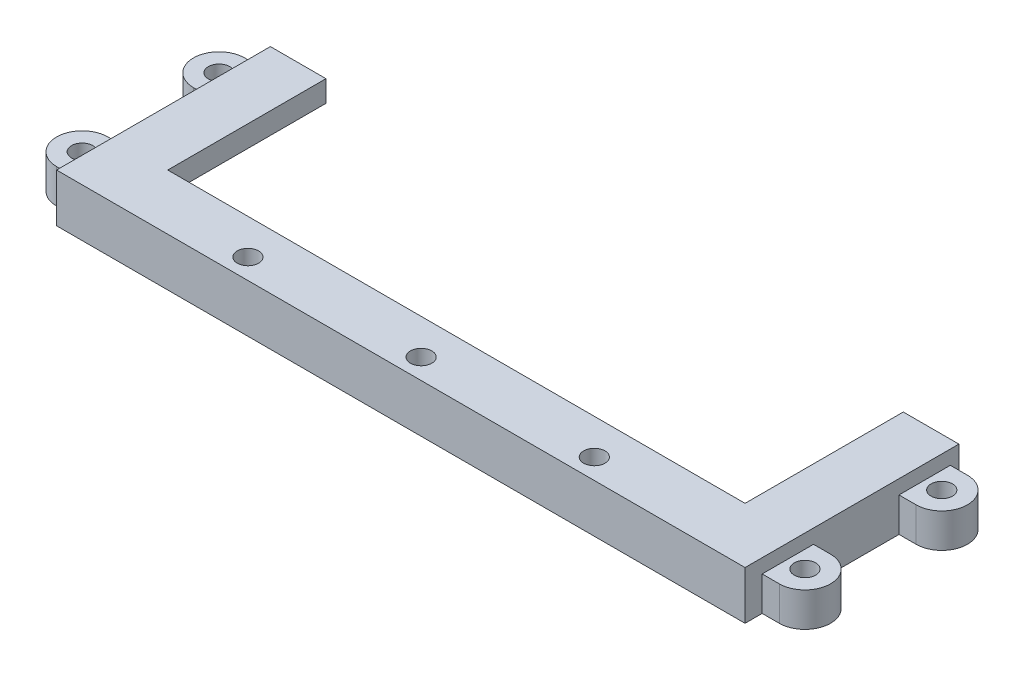
ISO-10303-21;
HEADER;
FILE_DESCRIPTION(('STEP AP214'),'2;1');
FILE_NAME('part.step','',(''),(''),'','','');
FILE_SCHEMA(('AUTOMOTIVE_DESIGN { 1 0 10303 214 1 1 1 1 }'));
ENDSEC;
DATA;
#1=APPLICATION_CONTEXT('core data for automotive mechanical design processes');
#2=APPLICATION_PROTOCOL_DEFINITION('international standard','automotive_design',2000,#1);
#3=PRODUCT_CONTEXT('',#1,'mechanical');
#4=PRODUCT('Part','Part','',(#3));
#5=PRODUCT_RELATED_PRODUCT_CATEGORY('part','',(#4));
#6=PRODUCT_DEFINITION_FORMATION('','',#4);
#7=PRODUCT_DEFINITION_CONTEXT('part definition',#1,'design');
#8=PRODUCT_DEFINITION('design','',#6,#7);
#9=PRODUCT_DEFINITION_SHAPE('','',#8);
#10=(LENGTH_UNIT() NAMED_UNIT(*) SI_UNIT(.MILLI.,.METRE.));
#11=(NAMED_UNIT(*) PLANE_ANGLE_UNIT() SI_UNIT($,.RADIAN.));
#12=(NAMED_UNIT(*) SI_UNIT($,.STERADIAN.) SOLID_ANGLE_UNIT());
#13=UNCERTAINTY_MEASURE_WITH_UNIT(LENGTH_MEASURE(1.E-05),#10,'distance_accuracy_value','');
#14=(GEOMETRIC_REPRESENTATION_CONTEXT(3) GLOBAL_UNCERTAINTY_ASSIGNED_CONTEXT((#13)) GLOBAL_UNIT_ASSIGNED_CONTEXT((#10,
#11,#12)) REPRESENTATION_CONTEXT('',''));
#15=CARTESIAN_POINT('',(0.,0.,0.));
#16=DIRECTION('',(0.,0.,1.));
#17=DIRECTION('',(1.,0.,0.));
#18=AXIS2_PLACEMENT_3D('',#15,#16,#17);
#19=CARTESIAN_POINT('',(40.,0.,45.25));
#20=DIRECTION('',(0.,1.,0.));
#21=DIRECTION('',(0.,0.,1.));
#22=AXIS2_PLACEMENT_3D('',#19,#20,#21);
#23=CYLINDRICAL_SURFACE('',#22,2.5);
#24=CARTESIAN_POINT('',(40.,0.,45.25));
#25=DIRECTION('',(0.,1.,0.));
#26=DIRECTION('',(0.,0.,1.));
#27=AXIS2_PLACEMENT_3D('',#24,#25,#26);
#28=CIRCLE('',#27,2.5);
#29=CARTESIAN_POINT('',(40.,0.,47.75));
#30=VERTEX_POINT('',#29);
#31=EDGE_CURVE('E52',#30,#30,#28,.T.);
#32=ORIENTED_EDGE('',*,*,#31,.F.);
#33=EDGE_LOOP('',(#32));
#34=FACE_BOUND('',#33,.T.);
#35=CARTESIAN_POINT('',(40.,11.3,45.25));
#36=DIRECTION('',(0.,1.,0.));
#37=DIRECTION('',(0.,0.,1.));
#38=AXIS2_PLACEMENT_3D('',#35,#36,#37);
#39=CIRCLE('',#38,2.5);
#40=CARTESIAN_POINT('',(40.,11.3,47.75));
#41=VERTEX_POINT('',#40);
#42=EDGE_CURVE('E11',#41,#41,#39,.T.);
#43=ORIENTED_EDGE('',*,*,#42,.T.);
#44=EDGE_LOOP('',(#43));
#45=FACE_BOUND('',#44,.T.);
#46=ADVANCED_FACE('F44',(#34,#45),#23,.F.);
#47=CARTESIAN_POINT('',(161.,0.,0.));
#48=DIRECTION('',(-1.,0.,0.));
#49=DIRECTION('',(0.,0.,1.));
#50=AXIS2_PLACEMENT_3D('',#47,#48,#49);
#51=PLANE('',#50);
#52=DIRECTION('',(0.,-1.,0.));
#53=VECTOR('',#52,1.);
#54=CARTESIAN_POINT('',(161.,8.,13.999999999999));
#55=LINE('',#54,#53);
#56=CARTESIAN_POINT('',(161.,8.,13.999999999999));
#57=VERTEX_POINT('',#56);
#58=CARTESIAN_POINT('',(161.,0.,13.999999999999));
#59=VERTEX_POINT('',#58);
#60=EDGE_CURVE('E350',#57,#59,#55,.T.);
#61=ORIENTED_EDGE('',*,*,#60,.F.);
#62=DIRECTION('',(0.,0.,1.));
#63=VECTOR('',#62,1.);
#64=CARTESIAN_POINT('',(161.,8.,1.99999999999903));
#65=LINE('',#64,#63);
#66=CARTESIAN_POINT('',(161.,8.,1.99999999999902));
#67=VERTEX_POINT('',#66);
#68=EDGE_CURVE('E323',#67,#57,#65,.T.);
#69=ORIENTED_EDGE('',*,*,#68,.F.);
#70=DIRECTION('',(0.,-1.,0.));
#71=VECTOR('',#70,1.);
#72=CARTESIAN_POINT('',(161.,8.,1.99999999999903));
#73=LINE('',#72,#71);
#74=CARTESIAN_POINT('',(161.,0.,1.99999999999902));
#75=VERTEX_POINT('',#74);
#76=EDGE_CURVE('E339',#67,#75,#73,.T.);
#77=ORIENTED_EDGE('',*,*,#76,.T.);
#78=DIRECTION('',(0.,0.,1.));
#79=VECTOR('',#78,1.);
#80=CARTESIAN_POINT('',(161.,0.,37.));
#81=LINE('',#80,#79);
#82=CARTESIAN_POINT('',(161.,0.,0.));
#83=VERTEX_POINT('',#82);
#84=EDGE_CURVE('E474',#83,#75,#81,.T.);
#85=ORIENTED_EDGE('',*,*,#84,.F.);
#86=DIRECTION('',(0.,-1.,0.));
#87=VECTOR('',#86,1.);
#88=CARTESIAN_POINT('',(161.,0.,0.));
#89=LINE('',#88,#87);
#90=CARTESIAN_POINT('',(161.,11.3,0.));
#91=VERTEX_POINT('',#90);
#92=EDGE_CURVE('E435',#83,#91,#89,.F.);
#93=ORIENTED_EDGE('',*,*,#92,.T.);
#94=DIRECTION('',(0.,0.,-1.));
#95=VECTOR('',#94,1.);
#96=CARTESIAN_POINT('',(161.,11.3,37.));
#97=LINE('',#96,#95);
#98=CARTESIAN_POINT('',(161.,11.3,50.));
#99=VERTEX_POINT('',#98);
#100=EDGE_CURVE('E481',#99,#91,#97,.T.);
#101=ORIENTED_EDGE('',*,*,#100,.F.);
#102=DIRECTION('',(0.,1.,0.));
#103=VECTOR('',#102,1.);
#104=CARTESIAN_POINT('',(161.,11.3,50.));
#105=LINE('',#104,#103);
#106=CARTESIAN_POINT('',(161.,0.,50.));
#107=VERTEX_POINT('',#106);
#108=EDGE_CURVE('E472',#107,#99,#105,.T.);
#109=ORIENTED_EDGE('',*,*,#108,.F.);
#110=CARTESIAN_POINT('',(161.,0.,46.));
#111=VERTEX_POINT('',#110);
#112=EDGE_CURVE('E479',#111,#107,#81,.T.);
#113=ORIENTED_EDGE('',*,*,#112,.F.);
#114=DIRECTION('',(0.,-1.,0.));
#115=VECTOR('',#114,1.);
#116=CARTESIAN_POINT('',(161.,8.,46.));
#117=LINE('',#116,#115);
#118=CARTESIAN_POINT('',(161.,8.,46.));
#119=VERTEX_POINT('',#118);
#120=EDGE_CURVE('E397',#119,#111,#117,.T.);
#121=ORIENTED_EDGE('',*,*,#120,.F.);
#122=DIRECTION('',(0.,0.,-1.));
#123=VECTOR('',#122,1.);
#124=CARTESIAN_POINT('',(161.,8.,46.));
#125=LINE('',#124,#123);
#126=CARTESIAN_POINT('',(161.,8.,34.));
#127=VERTEX_POINT('',#126);
#128=EDGE_CURVE('E368',#119,#127,#125,.T.);
#129=ORIENTED_EDGE('',*,*,#128,.T.);
#130=DIRECTION('',(0.,-1.,0.));
#131=VECTOR('',#130,1.);
#132=CARTESIAN_POINT('',(161.,8.,34.));
#133=LINE('',#132,#131);
#134=CARTESIAN_POINT('',(161.,0.,34.));
#135=VERTEX_POINT('',#134);
#136=EDGE_CURVE('E383',#127,#135,#133,.T.);
#137=ORIENTED_EDGE('',*,*,#136,.T.);
#138=EDGE_CURVE('E478',#59,#135,#81,.T.);
#139=ORIENTED_EDGE('',*,*,#138,.F.);
#140=EDGE_LOOP('',(#61,#69,#77,#85,#93,#101,#109,#113,#121,#129,#137,#139));
#141=FACE_BOUND('',#140,.T.);
#142=ADVANCED_FACE('F567',(#141),#51,.F.);
#143=CARTESIAN_POINT('',(161.,11.3,37.));
#144=DIRECTION('',(0.,0.,-1.));
#145=DIRECTION('',(-1.,0.,0.));
#146=AXIS2_PLACEMENT_3D('',#143,#144,#145);
#147=PLANE('',#146);
#148=DIRECTION('',(1.,0.,0.));
#149=VECTOR('',#148,1.);
#150=CARTESIAN_POINT('',(5.,6.3,37.));
#151=LINE('',#150,#149);
#152=CARTESIAN_POINT('',(13.,6.3,37.));
#153=VERTEX_POINT('',#152);
#154=CARTESIAN_POINT('',(148.,6.3,37.));
#155=VERTEX_POINT('',#154);
#156=EDGE_CURVE('E407',#153,#155,#151,.T.);
#157=ORIENTED_EDGE('',*,*,#156,.F.);
#158=DIRECTION('',(0.,1.,0.));
#159=VECTOR('',#158,1.);
#160=CARTESIAN_POINT('',(13.,11.3,37.));
#161=LINE('',#160,#159);
#162=CARTESIAN_POINT('',(13.,11.3,37.));
#163=VERTEX_POINT('',#162);
#164=EDGE_CURVE('E510',#153,#163,#161,.T.);
#165=ORIENTED_EDGE('',*,*,#164,.T.);
#166=DIRECTION('',(-1.,0.,0.));
#167=VECTOR('',#166,1.);
#168=CARTESIAN_POINT('',(161.,11.3,37.));
#169=LINE('',#168,#167);
#170=CARTESIAN_POINT('',(148.,11.3,37.));
#171=VERTEX_POINT('',#170);
#172=EDGE_CURVE('E486',#171,#163,#169,.T.);
#173=ORIENTED_EDGE('',*,*,#172,.F.);
#174=DIRECTION('',(0.,1.,0.));
#175=VECTOR('',#174,1.);
#176=CARTESIAN_POINT('',(148.,11.3,37.));
#177=LINE('',#176,#175);
#178=EDGE_CURVE('E446',#171,#155,#177,.F.);
#179=ORIENTED_EDGE('',*,*,#178,.T.);
#180=EDGE_LOOP('',(#157,#165,#173,#179));
#181=FACE_BOUND('',#180,.T.);
#182=ADVANCED_FACE('F596',(#181),#147,.T.);
#183=CARTESIAN_POINT('',(0.,0.,0.));
#184=DIRECTION('',(0.,0.,-1.));
#185=DIRECTION('',(-1.,0.,0.));
#186=AXIS2_PLACEMENT_3D('',#183,#184,#185);
#187=PLANE('',#186);
#188=DIRECTION('',(1.,0.,0.));
#189=VECTOR('',#188,1.);
#190=CARTESIAN_POINT('',(5.,0.,0.));
#191=LINE('',#190,#189);
#192=CARTESIAN_POINT('',(0.,0.,0.));
#193=VERTEX_POINT('',#192);
#194=CARTESIAN_POINT('',(5.,0.,0.));
#195=VERTEX_POINT('',#194);
#196=EDGE_CURVE('E534',#193,#195,#191,.T.);
#197=ORIENTED_EDGE('',*,*,#196,.F.);
#198=DIRECTION('',(0.,-1.,0.));
#199=VECTOR('',#198,1.);
#200=CARTESIAN_POINT('',(0.,0.,0.));
#201=LINE('',#200,#199);
#202=CARTESIAN_POINT('',(0.,11.3,0.));
#203=VERTEX_POINT('',#202);
#204=EDGE_CURVE('E527',#203,#193,#201,.T.);
#205=ORIENTED_EDGE('',*,*,#204,.F.);
#206=DIRECTION('',(-1.,0.,0.));
#207=VECTOR('',#206,1.);
#208=CARTESIAN_POINT('',(0.,11.3,0.));
#209=LINE('',#208,#207);
#210=CARTESIAN_POINT('',(13.,11.3,0.));
#211=VERTEX_POINT('',#210);
#212=EDGE_CURVE('E513',#211,#203,#209,.T.);
#213=ORIENTED_EDGE('',*,*,#212,.F.);
#214=DIRECTION('',(0.,1.,0.));
#215=VECTOR('',#214,1.);
#216=CARTESIAN_POINT('',(13.,11.3,0.));
#217=LINE('',#216,#215);
#218=CARTESIAN_POINT('',(13.,6.3,0.));
#219=VERTEX_POINT('',#218);
#220=EDGE_CURVE('E505',#219,#211,#217,.T.);
#221=ORIENTED_EDGE('',*,*,#220,.F.);
#222=DIRECTION('',(1.,0.,0.));
#223=VECTOR('',#222,1.);
#224=CARTESIAN_POINT('',(13.,6.3,0.));
#225=LINE('',#224,#223);
#226=CARTESIAN_POINT('',(5.,6.3,0.));
#227=VERTEX_POINT('',#226);
#228=EDGE_CURVE('E493',#227,#219,#225,.T.);
#229=ORIENTED_EDGE('',*,*,#228,.F.);
#230=DIRECTION('',(0.,1.,0.));
#231=VECTOR('',#230,1.);
#232=CARTESIAN_POINT('',(5.,6.3,0.));
#233=LINE('',#232,#231);
#234=EDGE_CURVE('E512',#195,#227,#233,.T.);
#235=ORIENTED_EDGE('',*,*,#234,.F.);
#236=EDGE_LOOP('',(#197,#205,#213,#221,#229,#235));
#237=FACE_BOUND('',#236,.T.);
#238=ADVANCED_FACE('F599',(#237),#187,.T.);
#239=CARTESIAN_POINT('',(13.,6.3,0.));
#240=DIRECTION('',(0.,-1.,0.));
#241=DIRECTION('',(1.,0.,0.));
#242=AXIS2_PLACEMENT_3D('',#239,#240,#241);
#243=PLANE('',#242);
#244=DIRECTION('',(0.,0.,1.));
#245=VECTOR('',#244,1.);
#246=CARTESIAN_POINT('',(13.,6.3,0.));
#247=LINE('',#246,#245);
#248=EDGE_CURVE('E503',#219,#153,#247,.T.);
#249=ORIENTED_EDGE('',*,*,#248,.T.);
#250=ORIENTED_EDGE('',*,*,#156,.T.);
#251=DIRECTION('',(0.,0.,1.));
#252=VECTOR('',#251,1.);
#253=CARTESIAN_POINT('',(148.,6.3,0.));
#254=LINE('',#253,#252);
#255=CARTESIAN_POINT('',(148.,6.3,0.));
#256=VERTEX_POINT('',#255);
#257=EDGE_CURVE('E459',#256,#155,#254,.T.);
#258=ORIENTED_EDGE('',*,*,#257,.F.);
#259=DIRECTION('',(-1.,0.,0.));
#260=VECTOR('',#259,1.);
#261=CARTESIAN_POINT('',(148.,6.3,0.));
#262=LINE('',#261,#260);
#263=CARTESIAN_POINT('',(156.,6.3,0.));
#264=VERTEX_POINT('',#263);
#265=EDGE_CURVE('E455',#256,#264,#262,.F.);
#266=ORIENTED_EDGE('',*,*,#265,.T.);
#267=DIRECTION('',(0.,0.,1.));
#268=VECTOR('',#267,1.);
#269=CARTESIAN_POINT('',(156.,6.3,0.));
#270=LINE('',#269,#268);
#271=CARTESIAN_POINT('',(156.,6.3,40.5));
#272=VERTEX_POINT('',#271);
#273=EDGE_CURVE('E461',#264,#272,#270,.T.);
#274=ORIENTED_EDGE('',*,*,#273,.T.);
#275=DIRECTION('',(-1.,0.,0.));
#276=VECTOR('',#275,1.);
#277=CARTESIAN_POINT('',(5.,6.3,40.5));
#278=LINE('',#277,#276);
#279=CARTESIAN_POINT('',(5.,6.3,40.5));
#280=VERTEX_POINT('',#279);
#281=EDGE_CURVE('E412',#272,#280,#278,.T.);
#282=ORIENTED_EDGE('',*,*,#281,.T.);
#283=DIRECTION('',(0.,0.,1.));
#284=VECTOR('',#283,1.);
#285=CARTESIAN_POINT('',(5.,6.3,0.));
#286=LINE('',#285,#284);
#287=EDGE_CURVE('E507',#227,#280,#286,.T.);
#288=ORIENTED_EDGE('',*,*,#287,.F.);
#289=ORIENTED_EDGE('',*,*,#228,.T.);
#290=EDGE_LOOP('',(#249,#250,#258,#266,#274,#282,#288,#289));
#291=FACE_BOUND('',#290,.T.);
#292=ADVANCED_FACE('F582',(#291),#243,.T.);
#293=CARTESIAN_POINT('',(13.,11.3,0.));
#294=DIRECTION('',(1.,0.,0.));
#295=DIRECTION('',(0.,0.,-1.));
#296=AXIS2_PLACEMENT_3D('',#293,#294,#295);
#297=PLANE('',#296);
#298=DIRECTION('',(0.,0.,1.));
#299=VECTOR('',#298,1.);
#300=CARTESIAN_POINT('',(13.,11.3,0.));
#301=LINE('',#300,#299);
#302=EDGE_CURVE('E518',#211,#163,#301,.T.);
#303=ORIENTED_EDGE('',*,*,#302,.T.);
#304=ORIENTED_EDGE('',*,*,#164,.F.);
#305=ORIENTED_EDGE('',*,*,#248,.F.);
#306=ORIENTED_EDGE('',*,*,#220,.T.);
#307=EDGE_LOOP('',(#303,#304,#305,#306));
#308=FACE_BOUND('',#307,.T.);
#309=ADVANCED_FACE('F574',(#308),#297,.T.);
#310=CARTESIAN_POINT('',(0.,11.3,0.));
#311=DIRECTION('',(0.,1.,0.));
#312=DIRECTION('',(0.,0.,1.));
#313=AXIS2_PLACEMENT_3D('',#310,#311,#312);
#314=PLANE('',#313);
#315=CARTESIAN_POINT('',(80.5,11.3,45.25));
#316=DIRECTION('',(0.,1.,0.));
#317=DIRECTION('',(0.,0.,1.));
#318=AXIS2_PLACEMENT_3D('',#315,#316,#317);
#319=CIRCLE('',#318,2.5);
#320=CARTESIAN_POINT('',(80.5,11.3,47.75));
#321=VERTEX_POINT('',#320);
#322=EDGE_CURVE('E767',#321,#321,#319,.T.);
#323=ORIENTED_EDGE('',*,*,#322,.F.);
#324=EDGE_LOOP('',(#323));
#325=FACE_BOUND('',#324,.T.);
#326=CARTESIAN_POINT('',(121.,11.3,45.25));
#327=DIRECTION('',(0.,1.,0.));
#328=DIRECTION('',(0.,0.,1.));
#329=AXIS2_PLACEMENT_3D('',#326,#327,#328);
#330=CIRCLE('',#329,2.5);
#331=CARTESIAN_POINT('',(121.,11.3,47.75));
#332=VERTEX_POINT('',#331);
#333=EDGE_CURVE('E769',#332,#332,#330,.T.);
#334=ORIENTED_EDGE('',*,*,#333,.F.);
#335=EDGE_LOOP('',(#334));
#336=FACE_BOUND('',#335,.T.);
#337=DIRECTION('',(0.,0.,1.));
#338=VECTOR('',#337,1.);
#339=CARTESIAN_POINT('',(0.,11.3,0.));
#340=LINE('',#339,#338);
#341=CARTESIAN_POINT('',(0.,11.3,50.));
#342=VERTEX_POINT('',#341);
#343=EDGE_CURVE('E522',#203,#342,#340,.T.);
#344=ORIENTED_EDGE('',*,*,#343,.T.);
#345=DIRECTION('',(-1.,0.,0.));
#346=VECTOR('',#345,1.);
#347=CARTESIAN_POINT('',(161.,11.3,50.));
#348=LINE('',#347,#346);
#349=EDGE_CURVE('E495',#99,#342,#348,.T.);
#350=ORIENTED_EDGE('',*,*,#349,.F.);
#351=ORIENTED_EDGE('',*,*,#100,.T.);
#352=DIRECTION('',(1.,0.,0.));
#353=VECTOR('',#352,1.);
#354=CARTESIAN_POINT('',(161.,11.3,0.));
#355=LINE('',#354,#353);
#356=CARTESIAN_POINT('',(148.,11.3,0.));
#357=VERTEX_POINT('',#356);
#358=EDGE_CURVE('E441',#91,#357,#355,.F.);
#359=ORIENTED_EDGE('',*,*,#358,.T.);
#360=DIRECTION('',(0.,0.,1.));
#361=VECTOR('',#360,1.);
#362=CARTESIAN_POINT('',(148.,11.3,0.));
#363=LINE('',#362,#361);
#364=EDGE_CURVE('E436',#357,#171,#363,.T.);
#365=ORIENTED_EDGE('',*,*,#364,.T.);
#366=ORIENTED_EDGE('',*,*,#172,.T.);
#367=ORIENTED_EDGE('',*,*,#302,.F.);
#368=ORIENTED_EDGE('',*,*,#212,.T.);
#369=EDGE_LOOP('',(#344,#350,#351,#359,#365,#366,#367,#368));
#370=FACE_BOUND('',#369,.T.);
#371=ORIENTED_EDGE('',*,*,#42,.F.);
#372=EDGE_LOOP('',(#371));
#373=FACE_BOUND('',#372,.T.);
#374=ADVANCED_FACE('F575',(#325,#336,#370,#373),#314,.T.);
#375=CARTESIAN_POINT('',(0.,0.,0.));
#376=DIRECTION('',(-1.,0.,0.));
#377=DIRECTION('',(0.,0.,1.));
#378=AXIS2_PLACEMENT_3D('',#375,#376,#377);
#379=PLANE('',#378);
#380=DIRECTION('',(0.,-1.,0.));
#381=VECTOR('',#380,1.);
#382=CARTESIAN_POINT('',(0.,8.,1.99999999999905));
#383=LINE('',#382,#381);
#384=CARTESIAN_POINT('',(0.,8.,1.99999999999905));
#385=VERTEX_POINT('',#384);
#386=CARTESIAN_POINT('',(0.,0.,1.99999999999905));
#387=VERTEX_POINT('',#386);
#388=EDGE_CURVE('E275',#385,#387,#383,.T.);
#389=ORIENTED_EDGE('',*,*,#388,.F.);
#390=DIRECTION('',(0.,0.,1.));
#391=VECTOR('',#390,1.);
#392=CARTESIAN_POINT('',(0.,8.,1.99999999999905));
#393=LINE('',#392,#391);
#394=CARTESIAN_POINT('',(0.,8.,13.9999999999991));
#395=VERTEX_POINT('',#394);
#396=EDGE_CURVE('E251',#385,#395,#393,.T.);
#397=ORIENTED_EDGE('',*,*,#396,.T.);
#398=DIRECTION('',(0.,-1.,0.));
#399=VECTOR('',#398,1.);
#400=CARTESIAN_POINT('',(0.,8.,13.9999999999991));
#401=LINE('',#400,#399);
#402=CARTESIAN_POINT('',(0.,0.,13.9999999999991));
#403=VERTEX_POINT('',#402);
#404=EDGE_CURVE('E243',#395,#403,#401,.T.);
#405=ORIENTED_EDGE('',*,*,#404,.T.);
#406=DIRECTION('',(0.,0.,1.));
#407=VECTOR('',#406,1.);
#408=CARTESIAN_POINT('',(0.,0.,0.));
#409=LINE('',#408,#407);
#410=CARTESIAN_POINT('',(0.,0.,34.));
#411=VERTEX_POINT('',#410);
#412=EDGE_CURVE('E537',#403,#411,#409,.T.);
#413=ORIENTED_EDGE('',*,*,#412,.T.);
#414=DIRECTION('',(0.,-1.,0.));
#415=VECTOR('',#414,1.);
#416=CARTESIAN_POINT('',(0.,8.,34.));
#417=LINE('',#416,#415);
#418=CARTESIAN_POINT('',(0.,8.,34.));
#419=VERTEX_POINT('',#418);
#420=EDGE_CURVE('E306',#419,#411,#417,.T.);
#421=ORIENTED_EDGE('',*,*,#420,.F.);
#422=DIRECTION('',(0.,0.,-1.));
#423=VECTOR('',#422,1.);
#424=CARTESIAN_POINT('',(0.,8.,46.));
#425=LINE('',#424,#423);
#426=CARTESIAN_POINT('',(0.,8.,46.));
#427=VERTEX_POINT('',#426);
#428=EDGE_CURVE('E285',#427,#419,#425,.T.);
#429=ORIENTED_EDGE('',*,*,#428,.F.);
#430=DIRECTION('',(0.,-1.,0.));
#431=VECTOR('',#430,1.);
#432=CARTESIAN_POINT('',(0.,8.,46.));
#433=LINE('',#432,#431);
#434=CARTESIAN_POINT('',(0.,0.,46.));
#435=VERTEX_POINT('',#434);
#436=EDGE_CURVE('E296',#427,#435,#433,.T.);
#437=ORIENTED_EDGE('',*,*,#436,.T.);
#438=CARTESIAN_POINT('',(0.,0.,50.));
#439=VERTEX_POINT('',#438);
#440=EDGE_CURVE('E530',#435,#439,#409,.T.);
#441=ORIENTED_EDGE('',*,*,#440,.T.);
#442=DIRECTION('',(0.,1.,0.));
#443=VECTOR('',#442,1.);
#444=CARTESIAN_POINT('',(0.,11.3,50.));
#445=LINE('',#444,#443);
#446=EDGE_CURVE('E470',#439,#342,#445,.T.);
#447=ORIENTED_EDGE('',*,*,#446,.T.);
#448=ORIENTED_EDGE('',*,*,#343,.F.);
#449=ORIENTED_EDGE('',*,*,#204,.T.);
#450=EDGE_CURVE('E533',#193,#387,#409,.T.);
#451=ORIENTED_EDGE('',*,*,#450,.T.);
#452=EDGE_LOOP('',(#389,#397,#405,#413,#421,#429,#437,#441,#447,#448,#449,#451));
#453=FACE_BOUND('',#452,.T.);
#454=ADVANCED_FACE('F573',(#453),#379,.T.);
#455=CARTESIAN_POINT('',(5.,0.,0.));
#456=DIRECTION('',(0.,-1.,0.));
#457=DIRECTION('',(1.,0.,0.));
#458=AXIS2_PLACEMENT_3D('',#455,#456,#457);
#459=PLANE('',#458);
#460=CARTESIAN_POINT('',(80.5,0.,45.25));
#461=DIRECTION('',(0.,1.,0.));
#462=DIRECTION('',(0.,0.,1.));
#463=AXIS2_PLACEMENT_3D('',#460,#461,#462);
#464=CIRCLE('',#463,2.5);
#465=CARTESIAN_POINT('',(80.5,0.,47.75));
#466=VERTEX_POINT('',#465);
#467=EDGE_CURVE('E766',#466,#466,#464,.T.);
#468=ORIENTED_EDGE('',*,*,#467,.T.);
#469=EDGE_LOOP('',(#468));
#470=FACE_BOUND('',#469,.T.);
#471=CARTESIAN_POINT('',(121.,0.,45.25));
#472=DIRECTION('',(0.,1.,0.));
#473=DIRECTION('',(0.,0.,1.));
#474=AXIS2_PLACEMENT_3D('',#471,#472,#473);
#475=CIRCLE('',#474,2.5);
#476=CARTESIAN_POINT('',(121.,0.,47.75));
#477=VERTEX_POINT('',#476);
#478=EDGE_CURVE('E773',#477,#477,#475,.T.);
#479=ORIENTED_EDGE('',*,*,#478,.T.);
#480=EDGE_LOOP('',(#479));
#481=FACE_BOUND('',#480,.T.);
#482=CARTESIAN_POINT('',(-3.99999999999998,0.,7.99999999999904));
#483=DIRECTION('',(0.,-1.,0.));
#484=DIRECTION('',(-1.,0.,0.));
#485=AXIS2_PLACEMENT_3D('',#482,#483,#484);
#486=CIRCLE('',#485,2.5);
#487=CARTESIAN_POINT('',(-6.49999999999997,0.,7.99999999999904));
#488=VERTEX_POINT('',#487);
#489=EDGE_CURVE('E557',#488,#488,#486,.T.);
#490=ORIENTED_EDGE('',*,*,#489,.F.);
#491=EDGE_LOOP('',(#490));
#492=FACE_BOUND('',#491,.T.);
#493=CARTESIAN_POINT('',(-4.,0.,40.));
#494=DIRECTION('',(0.,1.,0.));
#495=DIRECTION('',(-1.,0.,0.));
#496=AXIS2_PLACEMENT_3D('',#493,#494,#495);
#497=CIRCLE('',#496,2.5);
#498=CARTESIAN_POINT('',(-6.5,0.,40.));
#499=VERTEX_POINT('',#498);
#500=EDGE_CURVE('E273',#499,#499,#497,.T.);
#501=ORIENTED_EDGE('',*,*,#500,.T.);
#502=EDGE_LOOP('',(#501));
#503=FACE_BOUND('',#502,.T.);
#504=CARTESIAN_POINT('',(165.,0.,7.99999999999902));
#505=DIRECTION('',(0.,1.,0.));
#506=DIRECTION('',(1.,0.,0.));
#507=AXIS2_PLACEMENT_3D('',#504,#505,#506);
#508=CIRCLE('',#507,2.5);
#509=CARTESIAN_POINT('',(167.5,0.,7.99999999999902));
#510=VERTEX_POINT('',#509);
#511=EDGE_CURVE('E309',#510,#510,#508,.T.);
#512=ORIENTED_EDGE('',*,*,#511,.T.);
#513=EDGE_LOOP('',(#512));
#514=FACE_BOUND('',#513,.T.);
#515=CARTESIAN_POINT('',(165.,0.,40.));
#516=DIRECTION('',(0.,-1.,0.));
#517=DIRECTION('',(1.,0.,0.));
#518=AXIS2_PLACEMENT_3D('',#515,#516,#517);
#519=CIRCLE('',#518,2.5);
#520=CARTESIAN_POINT('',(167.5,0.,40.));
#521=VERTEX_POINT('',#520);
#522=EDGE_CURVE('E354',#521,#521,#519,.T.);
#523=ORIENTED_EDGE('',*,*,#522,.F.);
#524=EDGE_LOOP('',(#523));
#525=FACE_BOUND('',#524,.T.);
#526=DIRECTION('',(0.,0.,1.));
#527=VECTOR('',#526,1.);
#528=CARTESIAN_POINT('',(5.,0.,0.));
#529=LINE('',#528,#527);
#530=CARTESIAN_POINT('',(5.,0.,40.5));
#531=VERTEX_POINT('',#530);
#532=EDGE_CURVE('E538',#195,#531,#529,.T.);
#533=ORIENTED_EDGE('',*,*,#532,.T.);
#534=DIRECTION('',(-1.,0.,0.));
#535=VECTOR('',#534,1.);
#536=CARTESIAN_POINT('',(5.,0.,40.5));
#537=LINE('',#536,#535);
#538=CARTESIAN_POINT('',(156.,0.,40.5));
#539=VERTEX_POINT('',#538);
#540=EDGE_CURVE('E400',#539,#531,#537,.T.);
#541=ORIENTED_EDGE('',*,*,#540,.F.);
#542=DIRECTION('',(0.,0.,1.));
#543=VECTOR('',#542,1.);
#544=CARTESIAN_POINT('',(156.,0.,0.));
#545=LINE('',#544,#543);
#546=CARTESIAN_POINT('',(156.,0.,0.));
#547=VERTEX_POINT('',#546);
#548=EDGE_CURVE('E433',#547,#539,#545,.T.);
#549=ORIENTED_EDGE('',*,*,#548,.F.);
#550=DIRECTION('',(-1.,0.,0.));
#551=VECTOR('',#550,1.);
#552=CARTESIAN_POINT('',(156.,0.,0.));
#553=LINE('',#552,#551);
#554=EDGE_CURVE('E424',#547,#83,#553,.F.);
#555=ORIENTED_EDGE('',*,*,#554,.T.);
#556=ORIENTED_EDGE('',*,*,#84,.T.);
#557=DIRECTION('',(-1.,0.,0.));
#558=VECTOR('',#557,1.);
#559=CARTESIAN_POINT('',(161.,0.,1.99999999999903));
#560=LINE('',#559,#558);
#561=CARTESIAN_POINT('',(165.,0.,1.99999999999902));
#562=VERTEX_POINT('',#561);
#563=EDGE_CURVE('E338',#562,#75,#560,.T.);
#564=ORIENTED_EDGE('',*,*,#563,.F.);
#565=CARTESIAN_POINT('',(165.,0.,7.99999999999902));
#566=DIRECTION('',(0.,1.,0.));
#567=DIRECTION('',(1.,0.,0.));
#568=AXIS2_PLACEMENT_3D('',#565,#566,#567);
#569=CIRCLE('',#568,6.);
#570=CARTESIAN_POINT('',(165.,0.,13.999999999999));
#571=VERTEX_POINT('',#570);
#572=EDGE_CURVE('E343',#571,#562,#569,.T.);
#573=ORIENTED_EDGE('',*,*,#572,.F.);
#574=DIRECTION('',(1.,0.,0.));
#575=VECTOR('',#574,1.);
#576=CARTESIAN_POINT('',(161.,0.,13.999999999999));
#577=LINE('',#576,#575);
#578=EDGE_CURVE('E330',#59,#571,#577,.T.);
#579=ORIENTED_EDGE('',*,*,#578,.F.);
#580=ORIENTED_EDGE('',*,*,#138,.T.);
#581=DIRECTION('',(1.,0.,0.));
#582=VECTOR('',#581,1.);
#583=CARTESIAN_POINT('',(161.,0.,34.));
#584=LINE('',#583,#582);
#585=CARTESIAN_POINT('',(165.,0.,34.));
#586=VERTEX_POINT('',#585);
#587=EDGE_CURVE('E389',#135,#586,#584,.T.);
#588=ORIENTED_EDGE('',*,*,#587,.T.);
#589=CARTESIAN_POINT('',(165.,0.,40.));
#590=DIRECTION('',(0.,-1.,0.));
#591=DIRECTION('',(1.,0.,0.));
#592=AXIS2_PLACEMENT_3D('',#589,#590,#591);
#593=CIRCLE('',#592,6.);
#594=CARTESIAN_POINT('',(165.,0.,46.));
#595=VERTEX_POINT('',#594);
#596=EDGE_CURVE('E387',#586,#595,#593,.T.);
#597=ORIENTED_EDGE('',*,*,#596,.T.);
#598=DIRECTION('',(-1.,0.,0.));
#599=VECTOR('',#598,1.);
#600=CARTESIAN_POINT('',(161.,0.,46.));
#601=LINE('',#600,#599);
#602=EDGE_CURVE('E373',#595,#111,#601,.T.);
#603=ORIENTED_EDGE('',*,*,#602,.T.);
#604=ORIENTED_EDGE('',*,*,#112,.T.);
#605=DIRECTION('',(-1.,0.,0.));
#606=VECTOR('',#605,1.);
#607=CARTESIAN_POINT('',(161.,0.,50.));
#608=LINE('',#607,#606);
#609=EDGE_CURVE('E483',#107,#439,#608,.T.);
#610=ORIENTED_EDGE('',*,*,#609,.T.);
#611=ORIENTED_EDGE('',*,*,#440,.F.);
#612=DIRECTION('',(1.,0.,0.));
#613=VECTOR('',#612,1.);
#614=CARTESIAN_POINT('',(0.,0.,46.));
#615=LINE('',#614,#613);
#616=CARTESIAN_POINT('',(-4.,0.,46.));
#617=VERTEX_POINT('',#616);
#618=EDGE_CURVE('E67',#617,#435,#615,.T.);
#619=ORIENTED_EDGE('',*,*,#618,.F.);
#620=CARTESIAN_POINT('',(-4.,0.,40.));
#621=DIRECTION('',(0.,1.,0.));
#622=DIRECTION('',(-1.,0.,0.));
#623=AXIS2_PLACEMENT_3D('',#620,#621,#622);
#624=CIRCLE('',#623,6.);
#625=CARTESIAN_POINT('',(-4.,0.,34.));
#626=VERTEX_POINT('',#625);
#627=EDGE_CURVE('E301',#626,#617,#624,.T.);
#628=ORIENTED_EDGE('',*,*,#627,.F.);
#629=DIRECTION('',(-1.,0.,0.));
#630=VECTOR('',#629,1.);
#631=CARTESIAN_POINT('',(0.,0.,34.));
#632=LINE('',#631,#630);
#633=EDGE_CURVE('E288',#411,#626,#632,.T.);
#634=ORIENTED_EDGE('',*,*,#633,.F.);
#635=ORIENTED_EDGE('',*,*,#412,.F.);
#636=DIRECTION('',(-1.,0.,0.));
#637=VECTOR('',#636,1.);
#638=CARTESIAN_POINT('',(0.,0.,13.9999999999991));
#639=LINE('',#638,#637);
#640=CARTESIAN_POINT('',(-3.99999999999998,0.,13.999999999999));
#641=VERTEX_POINT('',#640);
#642=EDGE_CURVE('E262',#403,#641,#639,.T.);
#643=ORIENTED_EDGE('',*,*,#642,.T.);
#644=CARTESIAN_POINT('',(-3.99999999999998,0.,7.99999999999904));
#645=DIRECTION('',(0.,-1.,0.));
#646=DIRECTION('',(-1.,0.,0.));
#647=AXIS2_PLACEMENT_3D('',#644,#645,#646);
#648=CIRCLE('',#647,6.);
#649=CARTESIAN_POINT('',(-3.99999999999998,0.,1.99999999999904));
#650=VERTEX_POINT('',#649);
#651=EDGE_CURVE('E238',#641,#650,#648,.T.);
#652=ORIENTED_EDGE('',*,*,#651,.T.);
#653=DIRECTION('',(1.,0.,0.));
#654=VECTOR('',#653,1.);
#655=CARTESIAN_POINT('',(0.,0.,1.99999999999905));
#656=LINE('',#655,#654);
#657=EDGE_CURVE('E256',#650,#387,#656,.T.);
#658=ORIENTED_EDGE('',*,*,#657,.T.);
#659=ORIENTED_EDGE('',*,*,#450,.F.);
#660=ORIENTED_EDGE('',*,*,#196,.T.);
#661=EDGE_LOOP('',(#533,#541,#549,#555,#556,#564,#573,#579,#580,#588,#597,#603,#604,#610,#611,
#619,#628,#634,#635,#643,#652,#658,#659,#660));
#662=FACE_BOUND('',#661,.T.);
#663=ORIENTED_EDGE('',*,*,#31,.T.);
#664=EDGE_LOOP('',(#663));
#665=FACE_BOUND('',#664,.T.);
#666=ADVANCED_FACE('F564',(#470,#481,#492,#503,#514,#525,#662,#665),#459,.T.);
#667=CARTESIAN_POINT('',(5.,6.3,0.));
#668=DIRECTION('',(1.,0.,0.));
#669=DIRECTION('',(0.,1.,0.));
#670=AXIS2_PLACEMENT_3D('',#667,#668,#669);
#671=PLANE('',#670);
#672=ORIENTED_EDGE('',*,*,#287,.T.);
#673=DIRECTION('',(0.,-1.,0.));
#674=VECTOR('',#673,1.);
#675=CARTESIAN_POINT('',(5.,6.3,40.5));
#676=LINE('',#675,#674);
#677=EDGE_CURVE('E423',#280,#531,#676,.T.);
#678=ORIENTED_EDGE('',*,*,#677,.T.);
#679=ORIENTED_EDGE('',*,*,#532,.F.);
#680=ORIENTED_EDGE('',*,*,#234,.T.);
#681=EDGE_LOOP('',(#672,#678,#679,#680));
#682=FACE_BOUND('',#681,.T.);
#683=ADVANCED_FACE('F594',(#682),#671,.T.);
#684=CARTESIAN_POINT('',(161.,11.3,50.));
#685=DIRECTION('',(0.,0.,1.));
#686=DIRECTION('',(1.,0.,0.));
#687=AXIS2_PLACEMENT_3D('',#684,#685,#686);
#688=PLANE('',#687);
#689=ORIENTED_EDGE('',*,*,#446,.F.);
#690=ORIENTED_EDGE('',*,*,#609,.F.);
#691=ORIENTED_EDGE('',*,*,#108,.T.);
#692=ORIENTED_EDGE('',*,*,#349,.T.);
#693=EDGE_LOOP('',(#689,#690,#691,#692));
#694=FACE_BOUND('',#693,.T.);
#695=ADVANCED_FACE('F597',(#694),#688,.T.);
#696=CARTESIAN_POINT('',(161.,0.,0.));
#697=DIRECTION('',(0.,0.,-1.));
#698=DIRECTION('',(1.,0.,0.));
#699=AXIS2_PLACEMENT_3D('',#696,#697,#698);
#700=PLANE('',#699);
#701=ORIENTED_EDGE('',*,*,#554,.F.);
#702=DIRECTION('',(0.,1.,0.));
#703=VECTOR('',#702,1.);
#704=CARTESIAN_POINT('',(156.,6.3,0.));
#705=LINE('',#704,#703);
#706=EDGE_CURVE('E440',#264,#547,#705,.F.);
#707=ORIENTED_EDGE('',*,*,#706,.F.);
#708=ORIENTED_EDGE('',*,*,#265,.F.);
#709=DIRECTION('',(0.,1.,0.));
#710=VECTOR('',#709,1.);
#711=CARTESIAN_POINT('',(148.,11.3,0.));
#712=LINE('',#711,#710);
#713=EDGE_CURVE('E444',#357,#256,#712,.F.);
#714=ORIENTED_EDGE('',*,*,#713,.F.);
#715=ORIENTED_EDGE('',*,*,#358,.F.);
#716=ORIENTED_EDGE('',*,*,#92,.F.);
#717=EDGE_LOOP('',(#701,#707,#708,#714,#715,#716));
#718=FACE_BOUND('',#717,.T.);
#719=ADVANCED_FACE('F606',(#718),#700,.T.);
#720=CARTESIAN_POINT('',(148.,11.3,0.));
#721=DIRECTION('',(-1.,0.,0.));
#722=DIRECTION('',(0.,0.,1.));
#723=AXIS2_PLACEMENT_3D('',#720,#721,#722);
#724=PLANE('',#723);
#725=ORIENTED_EDGE('',*,*,#257,.T.);
#726=ORIENTED_EDGE('',*,*,#178,.F.);
#727=ORIENTED_EDGE('',*,*,#364,.F.);
#728=ORIENTED_EDGE('',*,*,#713,.T.);
#729=EDGE_LOOP('',(#725,#726,#727,#728));
#730=FACE_BOUND('',#729,.T.);
#731=ADVANCED_FACE('F617',(#730),#724,.T.);
#732=CARTESIAN_POINT('',(156.,6.3,0.));
#733=DIRECTION('',(-1.,0.,0.));
#734=DIRECTION('',(0.,-1.,0.));
#735=AXIS2_PLACEMENT_3D('',#732,#733,#734);
#736=PLANE('',#735);
#737=ORIENTED_EDGE('',*,*,#548,.T.);
#738=DIRECTION('',(0.,-1.,0.));
#739=VECTOR('',#738,1.);
#740=CARTESIAN_POINT('',(156.,6.3,40.5));
#741=LINE('',#740,#739);
#742=EDGE_CURVE('E417',#272,#539,#741,.T.);
#743=ORIENTED_EDGE('',*,*,#742,.F.);
#744=ORIENTED_EDGE('',*,*,#273,.F.);
#745=ORIENTED_EDGE('',*,*,#706,.T.);
#746=EDGE_LOOP('',(#737,#743,#744,#745));
#747=FACE_BOUND('',#746,.T.);
#748=ADVANCED_FACE('F614',(#747),#736,.T.);
#749=CARTESIAN_POINT('',(5.,6.3,40.5));
#750=DIRECTION('',(0.,0.,1.));
#751=DIRECTION('',(0.,-1.,0.));
#752=AXIS2_PLACEMENT_3D('',#749,#750,#751);
#753=PLANE('',#752);
#754=ORIENTED_EDGE('',*,*,#540,.T.);
#755=ORIENTED_EDGE('',*,*,#677,.F.);
#756=ORIENTED_EDGE('',*,*,#281,.F.);
#757=ORIENTED_EDGE('',*,*,#742,.T.);
#758=EDGE_LOOP('',(#754,#755,#756,#757));
#759=FACE_BOUND('',#758,.T.);
#760=ADVANCED_FACE('F619',(#759),#753,.F.);
#761=CARTESIAN_POINT('',(161.,8.,46.));
#762=DIRECTION('',(0.,0.,1.));
#763=DIRECTION('',(0.,-1.,0.));
#764=AXIS2_PLACEMENT_3D('',#761,#762,#763);
#765=PLANE('',#764);
#766=ORIENTED_EDGE('',*,*,#602,.F.);
#767=DIRECTION('',(0.,-1.,0.));
#768=VECTOR('',#767,1.);
#769=CARTESIAN_POINT('',(165.,8.,46.));
#770=LINE('',#769,#768);
#771=CARTESIAN_POINT('',(165.,8.,46.));
#772=VERTEX_POINT('',#771);
#773=EDGE_CURVE('E402',#772,#595,#770,.T.);
#774=ORIENTED_EDGE('',*,*,#773,.F.);
#775=DIRECTION('',(-1.,0.,0.));
#776=VECTOR('',#775,1.);
#777=CARTESIAN_POINT('',(161.,8.,46.));
#778=LINE('',#777,#776);
#779=EDGE_CURVE('E382',#772,#119,#778,.T.);
#780=ORIENTED_EDGE('',*,*,#779,.T.);
#781=ORIENTED_EDGE('',*,*,#120,.T.);
#782=EDGE_LOOP('',(#766,#774,#780,#781));
#783=FACE_BOUND('',#782,.T.);
#784=ADVANCED_FACE('F629',(#783),#765,.T.);
#785=CARTESIAN_POINT('',(165.,8.,40.));
#786=DIRECTION('',(0.,-1.,0.));
#787=DIRECTION('',(1.,0.,0.));
#788=AXIS2_PLACEMENT_3D('',#785,#786,#787);
#789=CYLINDRICAL_SURFACE('',#788,6.);
#790=ORIENTED_EDGE('',*,*,#596,.F.);
#791=DIRECTION('',(0.,-1.,0.));
#792=VECTOR('',#791,1.);
#793=CARTESIAN_POINT('',(165.,8.,34.));
#794=LINE('',#793,#792);
#795=CARTESIAN_POINT('',(165.,8.,34.));
#796=VERTEX_POINT('',#795);
#797=EDGE_CURVE('E404',#796,#586,#794,.T.);
#798=ORIENTED_EDGE('',*,*,#797,.F.);
#799=CARTESIAN_POINT('',(165.,8.,40.));
#800=DIRECTION('',(0.,-1.,0.));
#801=DIRECTION('',(1.,0.,0.));
#802=AXIS2_PLACEMENT_3D('',#799,#800,#801);
#803=CIRCLE('',#802,6.);
#804=EDGE_CURVE('E380',#796,#772,#803,.T.);
#805=ORIENTED_EDGE('',*,*,#804,.T.);
#806=ORIENTED_EDGE('',*,*,#773,.T.);
#807=EDGE_LOOP('',(#790,#798,#805,#806));
#808=FACE_BOUND('',#807,.T.);
#809=ADVANCED_FACE('F687',(#808),#789,.T.);
#810=CARTESIAN_POINT('',(161.,8.,34.));
#811=DIRECTION('',(0.,0.,-1.));
#812=DIRECTION('',(-1.,0.,0.));
#813=AXIS2_PLACEMENT_3D('',#810,#811,#812);
#814=PLANE('',#813);
#815=ORIENTED_EDGE('',*,*,#587,.F.);
#816=ORIENTED_EDGE('',*,*,#136,.F.);
#817=DIRECTION('',(1.,0.,0.));
#818=VECTOR('',#817,1.);
#819=CARTESIAN_POINT('',(161.,8.,34.));
#820=LINE('',#819,#818);
#821=EDGE_CURVE('E375',#127,#796,#820,.T.);
#822=ORIENTED_EDGE('',*,*,#821,.T.);
#823=ORIENTED_EDGE('',*,*,#797,.T.);
#824=EDGE_LOOP('',(#815,#816,#822,#823));
#825=FACE_BOUND('',#824,.T.);
#826=ADVANCED_FACE('F683',(#825),#814,.T.);
#827=CARTESIAN_POINT('',(165.,8.,40.));
#828=DIRECTION('',(0.,-1.,0.));
#829=DIRECTION('',(1.,0.,0.));
#830=AXIS2_PLACEMENT_3D('',#827,#828,#829);
#831=PLANE('',#830);
#832=CARTESIAN_POINT('',(165.,8.,40.));
#833=DIRECTION('',(0.,-1.,0.));
#834=DIRECTION('',(1.,0.,0.));
#835=AXIS2_PLACEMENT_3D('',#832,#833,#834);
#836=CIRCLE('',#835,2.5);
#837=CARTESIAN_POINT('',(167.5,8.,40.));
#838=VERTEX_POINT('',#837);
#839=EDGE_CURVE('E370',#838,#838,#836,.T.);
#840=ORIENTED_EDGE('',*,*,#839,.T.);
#841=EDGE_LOOP('',(#840));
#842=FACE_BOUND('',#841,.T.);
#843=ORIENTED_EDGE('',*,*,#128,.F.);
#844=ORIENTED_EDGE('',*,*,#779,.F.);
#845=ORIENTED_EDGE('',*,*,#804,.F.);
#846=ORIENTED_EDGE('',*,*,#821,.F.);
#847=EDGE_LOOP('',(#843,#844,#845,#846));
#848=FACE_BOUND('',#847,.T.);
#849=ADVANCED_FACE('F688',(#842,#848),#831,.F.);
#850=CARTESIAN_POINT('',(165.,11.3,40.));
#851=DIRECTION('',(0.,-1.,0.));
#852=DIRECTION('',(1.,0.,0.));
#853=AXIS2_PLACEMENT_3D('',#850,#851,#852);
#854=CYLINDRICAL_SURFACE('',#853,2.5);
#855=ORIENTED_EDGE('',*,*,#522,.T.);
#856=EDGE_LOOP('',(#855));
#857=FACE_BOUND('',#856,.T.);
#858=ORIENTED_EDGE('',*,*,#839,.F.);
#859=EDGE_LOOP('',(#858));
#860=FACE_BOUND('',#859,.T.);
#861=ADVANCED_FACE('F705',(#857,#860),#854,.F.);
#862=CARTESIAN_POINT('',(161.,8.,13.999999999999));
#863=DIRECTION('',(0.,0.,-1.));
#864=DIRECTION('',(-1.,0.,0.));
#865=AXIS2_PLACEMENT_3D('',#862,#863,#864);
#866=PLANE('',#865);
#867=ORIENTED_EDGE('',*,*,#578,.T.);
#868=DIRECTION('',(0.,-1.,0.));
#869=VECTOR('',#868,1.);
#870=CARTESIAN_POINT('',(165.,8.,13.999999999999));
#871=LINE('',#870,#869);
#872=CARTESIAN_POINT('',(165.,8.,13.999999999999));
#873=VERTEX_POINT('',#872);
#874=EDGE_CURVE('E353',#873,#571,#871,.T.);
#875=ORIENTED_EDGE('',*,*,#874,.F.);
#876=DIRECTION('',(1.,0.,0.));
#877=VECTOR('',#876,1.);
#878=CARTESIAN_POINT('',(161.,8.,13.999999999999));
#879=LINE('',#878,#877);
#880=EDGE_CURVE('E337',#57,#873,#879,.T.);
#881=ORIENTED_EDGE('',*,*,#880,.F.);
#882=ORIENTED_EDGE('',*,*,#60,.T.);
#883=EDGE_LOOP('',(#867,#875,#881,#882));
#884=FACE_BOUND('',#883,.T.);
#885=ADVANCED_FACE('F643',(#884),#866,.F.);
#886=CARTESIAN_POINT('',(165.,8.,7.99999999999902));
#887=DIRECTION('',(0.,-1.,0.));
#888=DIRECTION('',(1.,0.,0.));
#889=AXIS2_PLACEMENT_3D('',#886,#887,#888);
#890=CYLINDRICAL_SURFACE('',#889,6.);
#891=ORIENTED_EDGE('',*,*,#572,.T.);
#892=DIRECTION('',(0.,-1.,0.));
#893=VECTOR('',#892,1.);
#894=CARTESIAN_POINT('',(165.,8.,1.99999999999902));
#895=LINE('',#894,#893);
#896=CARTESIAN_POINT('',(165.,8.,1.99999999999902));
#897=VERTEX_POINT('',#896);
#898=EDGE_CURVE('E356',#897,#562,#895,.T.);
#899=ORIENTED_EDGE('',*,*,#898,.F.);
#900=CARTESIAN_POINT('',(165.,8.,7.99999999999902));
#901=DIRECTION('',(0.,1.,0.));
#902=DIRECTION('',(1.,0.,0.));
#903=AXIS2_PLACEMENT_3D('',#900,#901,#902);
#904=CIRCLE('',#903,6.);
#905=EDGE_CURVE('E334',#873,#897,#904,.T.);
#906=ORIENTED_EDGE('',*,*,#905,.F.);
#907=ORIENTED_EDGE('',*,*,#874,.T.);
#908=EDGE_LOOP('',(#891,#899,#906,#907));
#909=FACE_BOUND('',#908,.T.);
#910=ADVANCED_FACE('F709',(#909),#890,.T.);
#911=CARTESIAN_POINT('',(161.,8.,1.99999999999903));
#912=DIRECTION('',(0.,0.,1.));
#913=DIRECTION('',(1.,0.,0.));
#914=AXIS2_PLACEMENT_3D('',#911,#912,#913);
#915=PLANE('',#914);
#916=ORIENTED_EDGE('',*,*,#563,.T.);
#917=ORIENTED_EDGE('',*,*,#76,.F.);
#918=DIRECTION('',(-1.,0.,0.));
#919=VECTOR('',#918,1.);
#920=CARTESIAN_POINT('',(161.,8.,1.99999999999903));
#921=LINE('',#920,#919);
#922=EDGE_CURVE('E327',#897,#67,#921,.T.);
#923=ORIENTED_EDGE('',*,*,#922,.F.);
#924=ORIENTED_EDGE('',*,*,#898,.T.);
#925=EDGE_LOOP('',(#916,#917,#923,#924));
#926=FACE_BOUND('',#925,.T.);
#927=ADVANCED_FACE('F652',(#926),#915,.F.);
#928=CARTESIAN_POINT('',(165.,8.,7.99999999999902));
#929=DIRECTION('',(0.,-1.,0.));
#930=DIRECTION('',(1.,0.,0.));
#931=AXIS2_PLACEMENT_3D('',#928,#929,#930);
#932=PLANE('',#931);
#933=CARTESIAN_POINT('',(165.,8.,7.99999999999902));
#934=DIRECTION('',(0.,-1.,0.));
#935=DIRECTION('',(1.,0.,0.));
#936=AXIS2_PLACEMENT_3D('',#933,#934,#935);
#937=CIRCLE('',#936,2.5);
#938=CARTESIAN_POINT('',(167.5,8.,7.99999999999902));
#939=VERTEX_POINT('',#938);
#940=EDGE_CURVE('E325',#939,#939,#937,.F.);
#941=ORIENTED_EDGE('',*,*,#940,.F.);
#942=EDGE_LOOP('',(#941));
#943=FACE_BOUND('',#942,.T.);
#944=ORIENTED_EDGE('',*,*,#68,.T.);
#945=ORIENTED_EDGE('',*,*,#880,.T.);
#946=ORIENTED_EDGE('',*,*,#905,.T.);
#947=ORIENTED_EDGE('',*,*,#922,.T.);
#948=EDGE_LOOP('',(#944,#945,#946,#947));
#949=FACE_BOUND('',#948,.T.);
#950=ADVANCED_FACE('F650',(#943,#949),#932,.F.);
#951=CARTESIAN_POINT('',(165.,11.3,7.99999999999902));
#952=DIRECTION('',(0.,-1.,0.));
#953=DIRECTION('',(1.,0.,0.));
#954=AXIS2_PLACEMENT_3D('',#951,#952,#953);
#955=CYLINDRICAL_SURFACE('',#954,2.5);
#956=ORIENTED_EDGE('',*,*,#511,.F.);
#957=EDGE_LOOP('',(#956));
#958=FACE_BOUND('',#957,.T.);
#959=ORIENTED_EDGE('',*,*,#940,.T.);
#960=EDGE_LOOP('',(#959));
#961=FACE_BOUND('',#960,.T.);
#962=ADVANCED_FACE('F712',(#958,#961),#955,.F.);
#963=CARTESIAN_POINT('',(0.,8.,34.));
#964=DIRECTION('',(0.,0.,1.));
#965=DIRECTION('',(1.,0.,0.));
#966=AXIS2_PLACEMENT_3D('',#963,#964,#965);
#967=PLANE('',#966);
#968=ORIENTED_EDGE('',*,*,#633,.T.);
#969=DIRECTION('',(0.,-1.,0.));
#970=VECTOR('',#969,1.);
#971=CARTESIAN_POINT('',(-4.,8.,34.));
#972=LINE('',#971,#970);
#973=CARTESIAN_POINT('',(-4.,8.,34.));
#974=VERTEX_POINT('',#973);
#975=EDGE_CURVE('E311',#974,#626,#972,.T.);
#976=ORIENTED_EDGE('',*,*,#975,.F.);
#977=DIRECTION('',(-1.,0.,0.));
#978=VECTOR('',#977,1.);
#979=CARTESIAN_POINT('',(0.,8.,34.));
#980=LINE('',#979,#978);
#981=EDGE_CURVE('E294',#419,#974,#980,.T.);
#982=ORIENTED_EDGE('',*,*,#981,.F.);
#983=ORIENTED_EDGE('',*,*,#420,.T.);
#984=EDGE_LOOP('',(#968,#976,#982,#983));
#985=FACE_BOUND('',#984,.T.);
#986=ADVANCED_FACE('F720',(#985),#967,.F.);
#987=CARTESIAN_POINT('',(-4.,8.,40.));
#988=DIRECTION('',(0.,-1.,0.));
#989=DIRECTION('',(1.,0.,0.));
#990=AXIS2_PLACEMENT_3D('',#987,#988,#989);
#991=CYLINDRICAL_SURFACE('',#990,6.);
#992=ORIENTED_EDGE('',*,*,#627,.T.);
#993=DIRECTION('',(0.,-1.,0.));
#994=VECTOR('',#993,1.);
#995=CARTESIAN_POINT('',(-4.,8.,46.));
#996=LINE('',#995,#994);
#997=CARTESIAN_POINT('',(-4.,8.,46.));
#998=VERTEX_POINT('',#997);
#999=EDGE_CURVE('E314',#998,#617,#996,.T.);
#1000=ORIENTED_EDGE('',*,*,#999,.F.);
#1001=CARTESIAN_POINT('',(-4.,8.,40.));
#1002=DIRECTION('',(0.,1.,0.));
#1003=DIRECTION('',(-1.,0.,0.));
#1004=AXIS2_PLACEMENT_3D('',#1001,#1002,#1003);
#1005=CIRCLE('',#1004,6.);
#1006=EDGE_CURVE('E292',#974,#998,#1005,.T.);
#1007=ORIENTED_EDGE('',*,*,#1006,.F.);
#1008=ORIENTED_EDGE('',*,*,#975,.T.);
#1009=EDGE_LOOP('',(#992,#1000,#1007,#1008));
#1010=FACE_BOUND('',#1009,.T.);
#1011=ADVANCED_FACE('F725',(#1010),#991,.T.);
#1012=CARTESIAN_POINT('',(0.,8.,46.));
#1013=DIRECTION('',(0.,0.,-1.));
#1014=DIRECTION('',(-1.,0.,0.));
#1015=AXIS2_PLACEMENT_3D('',#1012,#1013,#1014);
#1016=PLANE('',#1015);
#1017=ORIENTED_EDGE('',*,*,#618,.T.);
#1018=ORIENTED_EDGE('',*,*,#436,.F.);
#1019=DIRECTION('',(1.,0.,0.));
#1020=VECTOR('',#1019,1.);
#1021=CARTESIAN_POINT('',(0.,8.,46.));
#1022=LINE('',#1021,#1020);
#1023=EDGE_CURVE('E289',#998,#427,#1022,.T.);
#1024=ORIENTED_EDGE('',*,*,#1023,.F.);
#1025=ORIENTED_EDGE('',*,*,#999,.T.);
#1026=EDGE_LOOP('',(#1017,#1018,#1024,#1025));
#1027=FACE_BOUND('',#1026,.T.);
#1028=ADVANCED_FACE('F721',(#1027),#1016,.F.);
#1029=CARTESIAN_POINT('',(-4.,8.,40.));
#1030=DIRECTION('',(0.,-1.,0.));
#1031=DIRECTION('',(-1.,0.,0.));
#1032=AXIS2_PLACEMENT_3D('',#1029,#1030,#1031);
#1033=PLANE('',#1032);
#1034=CARTESIAN_POINT('',(-4.,8.,40.));
#1035=DIRECTION('',(0.,-1.,0.));
#1036=DIRECTION('',(1.,0.,0.));
#1037=AXIS2_PLACEMENT_3D('',#1034,#1035,#1036);
#1038=CIRCLE('',#1037,2.5);
#1039=CARTESIAN_POINT('',(-1.50000000000001,8.,40.));
#1040=VERTEX_POINT('',#1039);
#1041=EDGE_CURVE('E282',#1040,#1040,#1038,.F.);
#1042=ORIENTED_EDGE('',*,*,#1041,.F.);
#1043=EDGE_LOOP('',(#1042));
#1044=FACE_BOUND('',#1043,.T.);
#1045=ORIENTED_EDGE('',*,*,#428,.T.);
#1046=ORIENTED_EDGE('',*,*,#981,.T.);
#1047=ORIENTED_EDGE('',*,*,#1006,.T.);
#1048=ORIENTED_EDGE('',*,*,#1023,.T.);
#1049=EDGE_LOOP('',(#1045,#1046,#1047,#1048));
#1050=FACE_BOUND('',#1049,.T.);
#1051=ADVANCED_FACE('F723',(#1044,#1050),#1033,.F.);
#1052=CARTESIAN_POINT('',(-4.,11.3,40.));
#1053=DIRECTION('',(0.,-1.,0.));
#1054=DIRECTION('',(1.,0.,0.));
#1055=AXIS2_PLACEMENT_3D('',#1052,#1053,#1054);
#1056=CYLINDRICAL_SURFACE('',#1055,2.5);
#1057=ORIENTED_EDGE('',*,*,#500,.F.);
#1058=EDGE_LOOP('',(#1057));
#1059=FACE_BOUND('',#1058,.T.);
#1060=ORIENTED_EDGE('',*,*,#1041,.T.);
#1061=EDGE_LOOP('',(#1060));
#1062=FACE_BOUND('',#1061,.T.);
#1063=ADVANCED_FACE('F733',(#1059,#1062),#1056,.F.);
#1064=CARTESIAN_POINT('',(0.,8.,1.99999999999905));
#1065=DIRECTION('',(0.,0.,-1.));
#1066=DIRECTION('',(-1.,0.,0.));
#1067=AXIS2_PLACEMENT_3D('',#1064,#1065,#1066);
#1068=PLANE('',#1067);
#1069=ORIENTED_EDGE('',*,*,#657,.F.);
#1070=DIRECTION('',(0.,-1.,0.));
#1071=VECTOR('',#1070,1.);
#1072=CARTESIAN_POINT('',(-3.99999999999998,8.,1.99999999999904));
#1073=LINE('',#1072,#1071);
#1074=CARTESIAN_POINT('',(-3.99999999999998,8.,1.99999999999904));
#1075=VERTEX_POINT('',#1074);
#1076=EDGE_CURVE('E245',#1075,#650,#1073,.T.);
#1077=ORIENTED_EDGE('',*,*,#1076,.F.);
#1078=DIRECTION('',(1.,0.,0.));
#1079=VECTOR('',#1078,1.);
#1080=CARTESIAN_POINT('',(0.,8.,1.99999999999905));
#1081=LINE('',#1080,#1079);
#1082=EDGE_CURVE('E250',#1075,#385,#1081,.T.);
#1083=ORIENTED_EDGE('',*,*,#1082,.T.);
#1084=ORIENTED_EDGE('',*,*,#388,.T.);
#1085=EDGE_LOOP('',(#1069,#1077,#1083,#1084));
#1086=FACE_BOUND('',#1085,.T.);
#1087=ADVANCED_FACE('F737',(#1086),#1068,.T.);
#1088=CARTESIAN_POINT('',(-3.99999999999998,8.,7.99999999999904));
#1089=DIRECTION('',(0.,-1.,0.));
#1090=DIRECTION('',(1.,0.,0.));
#1091=AXIS2_PLACEMENT_3D('',#1088,#1089,#1090);
#1092=CYLINDRICAL_SURFACE('',#1091,6.);
#1093=ORIENTED_EDGE('',*,*,#651,.F.);
#1094=DIRECTION('',(0.,-1.,0.));
#1095=VECTOR('',#1094,1.);
#1096=CARTESIAN_POINT('',(-3.99999999999998,8.,13.999999999999));
#1097=LINE('',#1096,#1095);
#1098=CARTESIAN_POINT('',(-3.99999999999998,8.,13.999999999999));
#1099=VERTEX_POINT('',#1098);
#1100=EDGE_CURVE('E231',#1099,#641,#1097,.T.);
#1101=ORIENTED_EDGE('',*,*,#1100,.F.);
#1102=CARTESIAN_POINT('',(-3.99999999999998,8.,7.99999999999904));
#1103=DIRECTION('',(0.,-1.,0.));
#1104=DIRECTION('',(-1.,0.,0.));
#1105=AXIS2_PLACEMENT_3D('',#1102,#1103,#1104);
#1106=CIRCLE('',#1105,6.);
#1107=EDGE_CURVE('E232',#1099,#1075,#1106,.T.);
#1108=ORIENTED_EDGE('',*,*,#1107,.T.);
#1109=ORIENTED_EDGE('',*,*,#1076,.T.);
#1110=EDGE_LOOP('',(#1093,#1101,#1108,#1109));
#1111=FACE_BOUND('',#1110,.T.);
#1112=ADVANCED_FACE('F234',(#1111),#1092,.T.);
#1113=CARTESIAN_POINT('',(0.,8.,13.9999999999991));
#1114=DIRECTION('',(0.,0.,1.));
#1115=DIRECTION('',(1.,0.,0.));
#1116=AXIS2_PLACEMENT_3D('',#1113,#1114,#1115);
#1117=PLANE('',#1116);
#1118=ORIENTED_EDGE('',*,*,#642,.F.);
#1119=ORIENTED_EDGE('',*,*,#404,.F.);
#1120=DIRECTION('',(-1.,0.,0.));
#1121=VECTOR('',#1120,1.);
#1122=CARTESIAN_POINT('',(0.,8.,13.9999999999991));
#1123=LINE('',#1122,#1121);
#1124=EDGE_CURVE('E58',#395,#1099,#1123,.T.);
#1125=ORIENTED_EDGE('',*,*,#1124,.T.);
#1126=ORIENTED_EDGE('',*,*,#1100,.T.);
#1127=EDGE_LOOP('',(#1118,#1119,#1125,#1126));
#1128=FACE_BOUND('',#1127,.T.);
#1129=ADVANCED_FACE('F249',(#1128),#1117,.T.);
#1130=CARTESIAN_POINT('',(-3.99999999999998,8.,7.99999999999904));
#1131=DIRECTION('',(0.,-1.,0.));
#1132=DIRECTION('',(-1.,0.,0.));
#1133=AXIS2_PLACEMENT_3D('',#1130,#1131,#1132);
#1134=PLANE('',#1133);
#1135=CARTESIAN_POINT('',(-3.99999999999998,8.,7.99999999999904));
#1136=DIRECTION('',(0.,-1.,0.));
#1137=DIRECTION('',(1.,0.,0.));
#1138=AXIS2_PLACEMENT_3D('',#1135,#1136,#1137);
#1139=CIRCLE('',#1138,2.5);
#1140=CARTESIAN_POINT('',(-1.49999999999998,8.,7.99999999999904));
#1141=VERTEX_POINT('',#1140);
#1142=EDGE_CURVE('E266',#1141,#1141,#1139,.T.);
#1143=ORIENTED_EDGE('',*,*,#1142,.T.);
#1144=EDGE_LOOP('',(#1143));
#1145=FACE_BOUND('',#1144,.T.);
#1146=ORIENTED_EDGE('',*,*,#396,.F.);
#1147=ORIENTED_EDGE('',*,*,#1082,.F.);
#1148=ORIENTED_EDGE('',*,*,#1107,.F.);
#1149=ORIENTED_EDGE('',*,*,#1124,.F.);
#1150=EDGE_LOOP('',(#1146,#1147,#1148,#1149));
#1151=FACE_BOUND('',#1150,.T.);
#1152=ADVANCED_FACE('F244',(#1145,#1151),#1134,.F.);
#1153=CARTESIAN_POINT('',(-3.99999999999998,11.3,7.99999999999904));
#1154=DIRECTION('',(0.,-1.,0.));
#1155=DIRECTION('',(1.,0.,0.));
#1156=AXIS2_PLACEMENT_3D('',#1153,#1154,#1155);
#1157=CYLINDRICAL_SURFACE('',#1156,2.5);
#1158=ORIENTED_EDGE('',*,*,#489,.T.);
#1159=EDGE_LOOP('',(#1158));
#1160=FACE_BOUND('',#1159,.T.);
#1161=ORIENTED_EDGE('',*,*,#1142,.F.);
#1162=EDGE_LOOP('',(#1161));
#1163=FACE_BOUND('',#1162,.T.);
#1164=ADVANCED_FACE('F750',(#1160,#1163),#1157,.F.);
#1165=CARTESIAN_POINT('',(121.,0.,45.25));
#1166=DIRECTION('',(0.,1.,0.));
#1167=DIRECTION('',(0.,0.,1.));
#1168=AXIS2_PLACEMENT_3D('',#1165,#1166,#1167);
#1169=CYLINDRICAL_SURFACE('',#1168,2.5);
#1170=ORIENTED_EDGE('',*,*,#478,.F.);
#1171=EDGE_LOOP('',(#1170));
#1172=FACE_BOUND('',#1171,.T.);
#1173=ORIENTED_EDGE('',*,*,#333,.T.);
#1174=EDGE_LOOP('',(#1173));
#1175=FACE_BOUND('',#1174,.T.);
#1176=ADVANCED_FACE('F751',(#1172,#1175),#1169,.F.);
#1177=CARTESIAN_POINT('',(80.5,0.,45.25));
#1178=DIRECTION('',(0.,1.,0.));
#1179=DIRECTION('',(0.,0.,1.));
#1180=AXIS2_PLACEMENT_3D('',#1177,#1178,#1179);
#1181=CYLINDRICAL_SURFACE('',#1180,2.5);
#1182=ORIENTED_EDGE('',*,*,#467,.F.);
#1183=EDGE_LOOP('',(#1182));
#1184=FACE_BOUND('',#1183,.T.);
#1185=ORIENTED_EDGE('',*,*,#322,.T.);
#1186=EDGE_LOOP('',(#1185));
#1187=FACE_BOUND('',#1186,.T.);
#1188=ADVANCED_FACE('F760',(#1184,#1187),#1181,.F.);
#1189=CLOSED_SHELL('',(#46,#142,#182,#238,#292,#309,#374,#454,#666,#683,#695,#719,#731,#748,
#760,#784,#809,#826,#849,#861,#885,#910,#927,#950,#962,#986,#1011,#1028,#1051,#1063,#1087,#1112,
#1129,#1152,#1164,#1176,#1188));
#1190=MANIFOLD_SOLID_BREP('B2',#1189);
#1191=ADVANCED_BREP_SHAPE_REPRESENTATION('',(#18,#1190),#14);
#1192=SHAPE_DEFINITION_REPRESENTATION(#9,#1191);
ENDSEC;
END-ISO-10303-21;
